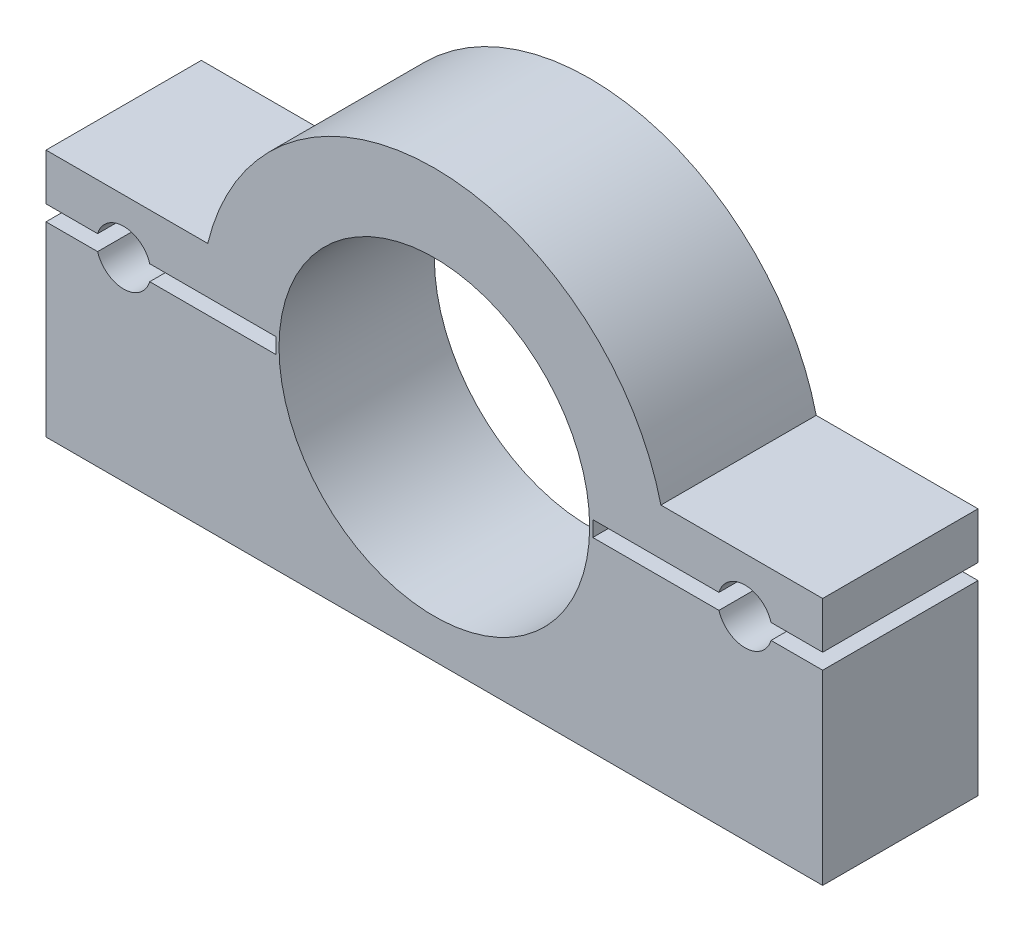
ISO-10303-21;
HEADER;
FILE_DESCRIPTION(('STEP AP214'),'2;1');
FILE_NAME('part.step','',(''),(''),'','','');
FILE_SCHEMA(('AUTOMOTIVE_DESIGN { 1 0 10303 214 1 1 1 1 }'));
ENDSEC;
DATA;
#1=APPLICATION_CONTEXT('core data for automotive mechanical design processes');
#2=APPLICATION_PROTOCOL_DEFINITION('international standard','automotive_design',2000,#1);
#3=PRODUCT_CONTEXT('',#1,'mechanical');
#4=PRODUCT('Part','Part','',(#3));
#5=PRODUCT_RELATED_PRODUCT_CATEGORY('part','',(#4));
#6=PRODUCT_DEFINITION_FORMATION('','',#4);
#7=PRODUCT_DEFINITION_CONTEXT('part definition',#1,'design');
#8=PRODUCT_DEFINITION('design','',#6,#7);
#9=PRODUCT_DEFINITION_SHAPE('','',#8);
#10=(LENGTH_UNIT() NAMED_UNIT(*) SI_UNIT(.MILLI.,.METRE.));
#11=(NAMED_UNIT(*) PLANE_ANGLE_UNIT() SI_UNIT($,.RADIAN.));
#12=(NAMED_UNIT(*) SI_UNIT($,.STERADIAN.) SOLID_ANGLE_UNIT());
#13=UNCERTAINTY_MEASURE_WITH_UNIT(LENGTH_MEASURE(1.E-05),#10,'distance_accuracy_value','');
#14=(GEOMETRIC_REPRESENTATION_CONTEXT(3) GLOBAL_UNCERTAINTY_ASSIGNED_CONTEXT((#13)) GLOBAL_UNIT_ASSIGNED_CONTEXT((#10,
#11,#12)) REPRESENTATION_CONTEXT('',''));
#15=CARTESIAN_POINT('',(0.,0.,0.));
#16=DIRECTION('',(0.,0.,1.));
#17=DIRECTION('',(1.,0.,0.));
#18=AXIS2_PLACEMENT_3D('',#15,#16,#17);
#19=CARTESIAN_POINT('',(51.,26.,-111.));
#20=DIRECTION('',(0.,1.,0.));
#21=DIRECTION('',(0.,0.,1.));
#22=AXIS2_PLACEMENT_3D('',#19,#20,#21);
#23=PLANE('',#22);
#24=DIRECTION('',(0.,0.,-1.));
#25=VECTOR('',#24,1.);
#26=CARTESIAN_POINT('',(43.3541019662497,26.,10.));
#27=LINE('',#26,#25);
#28=CARTESIAN_POINT('',(43.3541019662497,26.,-10.));
#29=VERTEX_POINT('',#28);
#30=CARTESIAN_POINT('',(43.3541019662497,26.,10.));
#31=VERTEX_POINT('',#30);
#32=EDGE_CURVE('E424',#29,#31,#27,.F.);
#33=ORIENTED_EDGE('',*,*,#32,.F.);
#34=DIRECTION('',(-1.,0.,0.));
#35=VECTOR('',#34,1.);
#36=CARTESIAN_POINT('',(0.,26.,-10.));
#37=LINE('',#36,#35);
#38=CARTESIAN_POINT('',(50.,26.,-10.));
#39=VERTEX_POINT('',#38);
#40=EDGE_CURVE('E391',#39,#29,#37,.T.);
#41=ORIENTED_EDGE('',*,*,#40,.F.);
#42=DIRECTION('',(0.,0.,-1.));
#43=VECTOR('',#42,1.);
#44=CARTESIAN_POINT('',(50.,26.,10.));
#45=LINE('',#44,#43);
#46=CARTESIAN_POINT('',(50.,26.,10.));
#47=VERTEX_POINT('',#46);
#48=EDGE_CURVE('E330',#47,#39,#45,.T.);
#49=ORIENTED_EDGE('',*,*,#48,.F.);
#50=DIRECTION('',(-1.,0.,0.));
#51=VECTOR('',#50,1.);
#52=CARTESIAN_POINT('',(0.,26.,10.));
#53=LINE('',#52,#51);
#54=EDGE_CURVE('E396',#47,#31,#53,.T.);
#55=ORIENTED_EDGE('',*,*,#54,.T.);
#56=EDGE_LOOP('',(#33,#41,#49,#55));
#57=FACE_BOUND('',#56,.T.);
#58=ADVANCED_FACE('F51',(#57),#23,.F.);
#59=DIRECTION('',(0.,0.,-1.));
#60=VECTOR('',#59,1.);
#61=CARTESIAN_POINT('',(36.6458980337503,26.,10.));
#62=LINE('',#61,#60);
#63=CARTESIAN_POINT('',(36.6458980337503,26.,10.));
#64=VERTEX_POINT('',#63);
#65=CARTESIAN_POINT('',(36.6458980337503,26.,-10.));
#66=VERTEX_POINT('',#65);
#67=EDGE_CURVE('E223',#64,#66,#62,.T.);
#68=ORIENTED_EDGE('',*,*,#67,.F.);
#69=CARTESIAN_POINT('',(20.4,26.,9.99999999999999));
#70=VERTEX_POINT('',#69);
#71=EDGE_CURVE('E395',#64,#70,#53,.T.);
#72=ORIENTED_EDGE('',*,*,#71,.T.);
#73=DIRECTION('',(0.,0.,1.));
#74=VECTOR('',#73,1.);
#75=CARTESIAN_POINT('',(20.4,26.,-111.));
#76=LINE('',#75,#74);
#77=CARTESIAN_POINT('',(20.4,26.,-9.99999999999999));
#78=VERTEX_POINT('',#77);
#79=EDGE_CURVE('E373',#78,#70,#76,.T.);
#80=ORIENTED_EDGE('',*,*,#79,.F.);
#81=EDGE_CURVE('E390',#66,#78,#37,.T.);
#82=ORIENTED_EDGE('',*,*,#81,.F.);
#83=EDGE_LOOP('',(#68,#72,#80,#82));
#84=FACE_BOUND('',#83,.T.);
#85=ADVANCED_FACE('F493',(#84),#23,.F.);
#86=CARTESIAN_POINT('',(20.4,24.,-111.));
#87=DIRECTION('',(0.,-1.,0.));
#88=DIRECTION('',(0.,0.,-1.));
#89=AXIS2_PLACEMENT_3D('',#86,#87,#88);
#90=PLANE('',#89);
#91=DIRECTION('',(0.,0.,-1.));
#92=VECTOR('',#91,1.);
#93=CARTESIAN_POINT('',(36.6458980337503,24.,10.));
#94=LINE('',#93,#92);
#95=CARTESIAN_POINT('',(36.6458980337503,24.,-10.));
#96=VERTEX_POINT('',#95);
#97=CARTESIAN_POINT('',(36.6458980337503,24.,10.));
#98=VERTEX_POINT('',#97);
#99=EDGE_CURVE('E11',#96,#98,#94,.F.);
#100=ORIENTED_EDGE('',*,*,#99,.F.);
#101=DIRECTION('',(1.,0.,0.));
#102=VECTOR('',#101,1.);
#103=CARTESIAN_POINT('',(0.,24.,-10.));
#104=LINE('',#103,#102);
#105=CARTESIAN_POINT('',(20.4,24.,-9.99999999999999));
#106=VERTEX_POINT('',#105);
#107=EDGE_CURVE('E367',#106,#96,#104,.T.);
#108=ORIENTED_EDGE('',*,*,#107,.F.);
#109=DIRECTION('',(0.,0.,1.));
#110=VECTOR('',#109,1.);
#111=CARTESIAN_POINT('',(20.4,24.,-111.));
#112=LINE('',#111,#110);
#113=CARTESIAN_POINT('',(20.4,24.,9.99999999999999));
#114=VERTEX_POINT('',#113);
#115=EDGE_CURVE('E380',#106,#114,#112,.T.);
#116=ORIENTED_EDGE('',*,*,#115,.T.);
#117=DIRECTION('',(1.,0.,0.));
#118=VECTOR('',#117,1.);
#119=CARTESIAN_POINT('',(0.,24.,10.));
#120=LINE('',#119,#118);
#121=EDGE_CURVE('E386',#114,#98,#120,.T.);
#122=ORIENTED_EDGE('',*,*,#121,.T.);
#123=EDGE_LOOP('',(#100,#108,#116,#122));
#124=FACE_BOUND('',#123,.T.);
#125=ADVANCED_FACE('F498',(#124),#90,.F.);
#126=DIRECTION('',(0.,0.,-1.));
#127=VECTOR('',#126,1.);
#128=CARTESIAN_POINT('',(43.3541019662497,24.,10.));
#129=LINE('',#128,#127);
#130=CARTESIAN_POINT('',(43.3541019662497,24.,10.));
#131=VERTEX_POINT('',#130);
#132=CARTESIAN_POINT('',(43.3541019662497,24.,-10.));
#133=VERTEX_POINT('',#132);
#134=EDGE_CURVE('E61',#131,#133,#129,.T.);
#135=ORIENTED_EDGE('',*,*,#134,.F.);
#136=CARTESIAN_POINT('',(50.,24.,10.));
#137=VERTEX_POINT('',#136);
#138=EDGE_CURVE('E377',#131,#137,#120,.T.);
#139=ORIENTED_EDGE('',*,*,#138,.T.);
#140=DIRECTION('',(0.,0.,1.));
#141=VECTOR('',#140,1.);
#142=CARTESIAN_POINT('',(50.,24.,10.));
#143=LINE('',#142,#141);
#144=CARTESIAN_POINT('',(50.,24.,-10.));
#145=VERTEX_POINT('',#144);
#146=EDGE_CURVE('E326',#145,#137,#143,.T.);
#147=ORIENTED_EDGE('',*,*,#146,.F.);
#148=EDGE_CURVE('E365',#133,#145,#104,.T.);
#149=ORIENTED_EDGE('',*,*,#148,.F.);
#150=EDGE_LOOP('',(#135,#139,#147,#149));
#151=FACE_BOUND('',#150,.T.);
#152=ADVANCED_FACE('F371',(#151),#90,.F.);
#153=CARTESIAN_POINT('',(-20.4,26.,-111.));
#154=DIRECTION('',(0.,1.,0.));
#155=DIRECTION('',(0.,0.,1.));
#156=AXIS2_PLACEMENT_3D('',#153,#154,#155);
#157=PLANE('',#156);
#158=DIRECTION('',(0.,0.,-1.));
#159=VECTOR('',#158,1.);
#160=CARTESIAN_POINT('',(-36.6458980337503,26.,10.));
#161=LINE('',#160,#159);
#162=CARTESIAN_POINT('',(-36.6458980337503,26.,-10.));
#163=VERTEX_POINT('',#162);
#164=CARTESIAN_POINT('',(-36.6458980337503,26.,10.));
#165=VERTEX_POINT('',#164);
#166=EDGE_CURVE('E203',#163,#165,#161,.F.);
#167=ORIENTED_EDGE('',*,*,#166,.F.);
#168=DIRECTION('',(-1.,0.,0.));
#169=VECTOR('',#168,1.);
#170=CARTESIAN_POINT('',(0.,26.,-10.));
#171=LINE('',#170,#169);
#172=CARTESIAN_POINT('',(-20.4,26.,-9.99999999999999));
#173=VERTEX_POINT('',#172);
#174=EDGE_CURVE('E218',#173,#163,#171,.T.);
#175=ORIENTED_EDGE('',*,*,#174,.F.);
#176=DIRECTION('',(0.,0.,1.));
#177=VECTOR('',#176,1.);
#178=CARTESIAN_POINT('',(-20.4,26.,-111.));
#179=LINE('',#178,#177);
#180=CARTESIAN_POINT('',(-20.4,26.,9.99999999999999));
#181=VERTEX_POINT('',#180);
#182=EDGE_CURVE('E384',#173,#181,#179,.T.);
#183=ORIENTED_EDGE('',*,*,#182,.T.);
#184=DIRECTION('',(-1.,0.,0.));
#185=VECTOR('',#184,1.);
#186=CARTESIAN_POINT('',(0.,26.,10.));
#187=LINE('',#186,#185);
#188=EDGE_CURVE('E221',#181,#165,#187,.T.);
#189=ORIENTED_EDGE('',*,*,#188,.T.);
#190=EDGE_LOOP('',(#167,#175,#183,#189));
#191=FACE_BOUND('',#190,.T.);
#192=ADVANCED_FACE('F216',(#191),#157,.F.);
#193=DIRECTION('',(0.,0.,-1.));
#194=VECTOR('',#193,1.);
#195=CARTESIAN_POINT('',(-43.3541019662497,26.,10.));
#196=LINE('',#195,#194);
#197=CARTESIAN_POINT('',(-43.3541019662497,26.,10.));
#198=VERTEX_POINT('',#197);
#199=CARTESIAN_POINT('',(-43.3541019662497,26.,-10.));
#200=VERTEX_POINT('',#199);
#201=EDGE_CURVE('E206',#198,#200,#196,.T.);
#202=ORIENTED_EDGE('',*,*,#201,.F.);
#203=CARTESIAN_POINT('',(-50.,26.,10.));
#204=VERTEX_POINT('',#203);
#205=EDGE_CURVE('E232',#198,#204,#187,.T.);
#206=ORIENTED_EDGE('',*,*,#205,.T.);
#207=DIRECTION('',(0.,0.,1.));
#208=VECTOR('',#207,1.);
#209=CARTESIAN_POINT('',(-50.,26.,10.));
#210=LINE('',#209,#208);
#211=CARTESIAN_POINT('',(-50.,26.,-10.));
#212=VERTEX_POINT('',#211);
#213=EDGE_CURVE('E338',#212,#204,#210,.T.);
#214=ORIENTED_EDGE('',*,*,#213,.F.);
#215=EDGE_CURVE('E233',#200,#212,#171,.T.);
#216=ORIENTED_EDGE('',*,*,#215,.F.);
#217=EDGE_LOOP('',(#202,#206,#214,#216));
#218=FACE_BOUND('',#217,.T.);
#219=ADVANCED_FACE('F451',(#218),#157,.F.);
#220=CARTESIAN_POINT('',(-51.,24.,-111.));
#221=DIRECTION('',(0.,-1.,0.));
#222=DIRECTION('',(0.,0.,-1.));
#223=AXIS2_PLACEMENT_3D('',#220,#221,#222);
#224=PLANE('',#223);
#225=DIRECTION('',(0.,0.,-1.));
#226=VECTOR('',#225,1.);
#227=CARTESIAN_POINT('',(-43.3541019662497,24.,10.));
#228=LINE('',#227,#226);
#229=CARTESIAN_POINT('',(-43.3541019662497,24.,-10.));
#230=VERTEX_POINT('',#229);
#231=CARTESIAN_POINT('',(-43.3541019662497,24.,10.));
#232=VERTEX_POINT('',#231);
#233=EDGE_CURVE('E351',#230,#232,#228,.F.);
#234=ORIENTED_EDGE('',*,*,#233,.F.);
#235=DIRECTION('',(1.,0.,0.));
#236=VECTOR('',#235,1.);
#237=CARTESIAN_POINT('',(0.,24.,-10.));
#238=LINE('',#237,#236);
#239=CARTESIAN_POINT('',(-50.,24.,-10.));
#240=VERTEX_POINT('',#239);
#241=EDGE_CURVE('E399',#240,#230,#238,.T.);
#242=ORIENTED_EDGE('',*,*,#241,.F.);
#243=DIRECTION('',(0.,0.,-1.));
#244=VECTOR('',#243,1.);
#245=CARTESIAN_POINT('',(-50.,24.,10.));
#246=LINE('',#245,#244);
#247=CARTESIAN_POINT('',(-50.,24.,10.));
#248=VERTEX_POINT('',#247);
#249=EDGE_CURVE('E334',#248,#240,#246,.T.);
#250=ORIENTED_EDGE('',*,*,#249,.F.);
#251=DIRECTION('',(1.,0.,0.));
#252=VECTOR('',#251,1.);
#253=CARTESIAN_POINT('',(0.,24.,10.));
#254=LINE('',#253,#252);
#255=EDGE_CURVE('E240',#248,#232,#254,.T.);
#256=ORIENTED_EDGE('',*,*,#255,.T.);
#257=EDGE_LOOP('',(#234,#242,#250,#256));
#258=FACE_BOUND('',#257,.T.);
#259=ADVANCED_FACE('F520',(#258),#224,.F.);
#260=DIRECTION('',(0.,0.,-1.));
#261=VECTOR('',#260,1.);
#262=CARTESIAN_POINT('',(-36.6458980337503,24.,10.));
#263=LINE('',#262,#261);
#264=CARTESIAN_POINT('',(-36.6458980337503,24.,10.));
#265=VERTEX_POINT('',#264);
#266=CARTESIAN_POINT('',(-36.6458980337503,24.,-10.));
#267=VERTEX_POINT('',#266);
#268=EDGE_CURVE('E348',#265,#267,#263,.T.);
#269=ORIENTED_EDGE('',*,*,#268,.F.);
#270=CARTESIAN_POINT('',(-20.4,24.,9.99999999999999));
#271=VERTEX_POINT('',#270);
#272=EDGE_CURVE('E402',#265,#271,#254,.T.);
#273=ORIENTED_EDGE('',*,*,#272,.T.);
#274=DIRECTION('',(0.,0.,1.));
#275=VECTOR('',#274,1.);
#276=CARTESIAN_POINT('',(-20.4,24.,-111.));
#277=LINE('',#276,#275);
#278=CARTESIAN_POINT('',(-20.4,24.,-9.99999999999999));
#279=VERTEX_POINT('',#278);
#280=EDGE_CURVE('E415',#279,#271,#277,.T.);
#281=ORIENTED_EDGE('',*,*,#280,.F.);
#282=EDGE_CURVE('E398',#267,#279,#238,.T.);
#283=ORIENTED_EDGE('',*,*,#282,.F.);
#284=EDGE_LOOP('',(#269,#273,#281,#283));
#285=FACE_BOUND('',#284,.T.);
#286=ADVANCED_FACE('F417',(#285),#224,.F.);
#287=CARTESIAN_POINT('',(-50.,32.,10.));
#288=DIRECTION('',(1.,0.,0.));
#289=DIRECTION('',(0.,0.,-1.));
#290=AXIS2_PLACEMENT_3D('',#287,#288,#289);
#291=PLANE('',#290);
#292=DIRECTION('',(0.,-1.,0.));
#293=VECTOR('',#292,1.);
#294=CARTESIAN_POINT('',(-50.,32.,-10.));
#295=LINE('',#294,#293);
#296=CARTESIAN_POINT('',(-50.,32.,-10.));
#297=VERTEX_POINT('',#296);
#298=EDGE_CURVE('E282',#297,#212,#295,.T.);
#299=ORIENTED_EDGE('',*,*,#298,.T.);
#300=ORIENTED_EDGE('',*,*,#213,.T.);
#301=DIRECTION('',(0.,-1.,0.));
#302=VECTOR('',#301,1.);
#303=CARTESIAN_POINT('',(-50.,32.,10.));
#304=LINE('',#303,#302);
#305=CARTESIAN_POINT('',(-50.,32.,10.));
#306=VERTEX_POINT('',#305);
#307=EDGE_CURVE('E259',#306,#204,#304,.T.);
#308=ORIENTED_EDGE('',*,*,#307,.F.);
#309=DIRECTION('',(0.,0.,-1.));
#310=VECTOR('',#309,1.);
#311=CARTESIAN_POINT('',(-50.,32.,10.));
#312=LINE('',#311,#310);
#313=EDGE_CURVE('E281',#306,#297,#312,.T.);
#314=ORIENTED_EDGE('',*,*,#313,.T.);
#315=EDGE_LOOP('',(#299,#300,#308,#314));
#316=FACE_BOUND('',#315,.T.);
#317=ADVANCED_FACE('F453',(#316),#291,.F.);
#318=CARTESIAN_POINT('',(50.,0.,10.));
#319=DIRECTION('',(-1.,0.,0.));
#320=DIRECTION('',(0.,0.,1.));
#321=AXIS2_PLACEMENT_3D('',#318,#319,#320);
#322=PLANE('',#321);
#323=DIRECTION('',(0.,1.,0.));
#324=VECTOR('',#323,1.);
#325=CARTESIAN_POINT('',(50.,0.,10.));
#326=LINE('',#325,#324);
#327=CARTESIAN_POINT('',(50.,32.,10.));
#328=VERTEX_POINT('',#327);
#329=EDGE_CURVE('E267',#47,#328,#326,.T.);
#330=ORIENTED_EDGE('',*,*,#329,.F.);
#331=ORIENTED_EDGE('',*,*,#48,.T.);
#332=DIRECTION('',(0.,1.,0.));
#333=VECTOR('',#332,1.);
#334=CARTESIAN_POINT('',(50.,0.,-10.));
#335=LINE('',#334,#333);
#336=CARTESIAN_POINT('',(50.,32.,-10.));
#337=VERTEX_POINT('',#336);
#338=EDGE_CURVE('E289',#39,#337,#335,.T.);
#339=ORIENTED_EDGE('',*,*,#338,.T.);
#340=DIRECTION('',(0.,0.,-1.));
#341=VECTOR('',#340,1.);
#342=CARTESIAN_POINT('',(50.,32.,10.));
#343=LINE('',#342,#341);
#344=EDGE_CURVE('E314',#328,#337,#343,.T.);
#345=ORIENTED_EDGE('',*,*,#344,.F.);
#346=EDGE_LOOP('',(#330,#331,#339,#345));
#347=FACE_BOUND('',#346,.T.);
#348=ADVANCED_FACE('F479',(#347),#322,.F.);
#349=CARTESIAN_POINT('',(0.,25.,10.));
#350=DIRECTION('',(0.,0.,1.));
#351=DIRECTION('',(1.,0.,0.));
#352=AXIS2_PLACEMENT_3D('',#349,#350,#351);
#353=PLANE('',#352);
#354=ORIENTED_EDGE('',*,*,#272,.F.);
#355=CARTESIAN_POINT('',(-40.,25.,10.));
#356=DIRECTION('',(0.,0.,1.));
#357=DIRECTION('',(1.,0.,0.));
#358=AXIS2_PLACEMENT_3D('',#355,#356,#357);
#359=CIRCLE('',#358,3.5);
#360=EDGE_CURVE('E211',#232,#265,#359,.T.);
#361=ORIENTED_EDGE('',*,*,#360,.F.);
#362=ORIENTED_EDGE('',*,*,#255,.F.);
#363=CARTESIAN_POINT('',(-50.,0.,10.));
#364=VERTEX_POINT('',#363);
#365=EDGE_CURVE('E264',#248,#364,#304,.T.);
#366=ORIENTED_EDGE('',*,*,#365,.T.);
#367=DIRECTION('',(1.,0.,0.));
#368=VECTOR('',#367,1.);
#369=CARTESIAN_POINT('',(-50.,0.,10.));
#370=LINE('',#369,#368);
#371=CARTESIAN_POINT('',(50.,0.,10.));
#372=VERTEX_POINT('',#371);
#373=EDGE_CURVE('E263',#364,#372,#370,.T.);
#374=ORIENTED_EDGE('',*,*,#373,.T.);
#375=EDGE_CURVE('E268',#372,#137,#326,.T.);
#376=ORIENTED_EDGE('',*,*,#375,.T.);
#377=ORIENTED_EDGE('',*,*,#138,.F.);
#378=CARTESIAN_POINT('',(40.,25.,10.));
#379=DIRECTION('',(0.,0.,1.));
#380=DIRECTION('',(1.,0.,0.));
#381=AXIS2_PLACEMENT_3D('',#378,#379,#380);
#382=CIRCLE('',#381,3.5);
#383=EDGE_CURVE('E75',#98,#131,#382,.T.);
#384=ORIENTED_EDGE('',*,*,#383,.F.);
#385=ORIENTED_EDGE('',*,*,#121,.F.);
#386=DIRECTION('',(0.,-1.,0.));
#387=VECTOR('',#386,1.);
#388=CARTESIAN_POINT('',(20.4,25.,10.));
#389=LINE('',#388,#387);
#390=EDGE_CURVE('E248',#70,#114,#389,.T.);
#391=ORIENTED_EDGE('',*,*,#390,.F.);
#392=ORIENTED_EDGE('',*,*,#71,.F.);
#393=EDGE_CURVE('E68',#31,#64,#382,.T.);
#394=ORIENTED_EDGE('',*,*,#393,.F.);
#395=ORIENTED_EDGE('',*,*,#54,.F.);
#396=ORIENTED_EDGE('',*,*,#329,.T.);
#397=DIRECTION('',(-1.,0.,0.));
#398=VECTOR('',#397,1.);
#399=CARTESIAN_POINT('',(50.,32.,10.));
#400=LINE('',#399,#398);
#401=CARTESIAN_POINT('',(29.1719,32.,10.));
#402=VERTEX_POINT('',#401);
#403=EDGE_CURVE('E272',#328,#402,#400,.T.);
#404=ORIENTED_EDGE('',*,*,#403,.T.);
#405=CARTESIAN_POINT('',(0.,25.,10.));
#406=DIRECTION('',(0.,0.,1.));
#407=DIRECTION('',(1.,0.,0.));
#408=AXIS2_PLACEMENT_3D('',#405,#406,#407);
#409=CIRCLE('',#408,29.999995826833);
#410=CARTESIAN_POINT('',(-29.1719,32.,10.));
#411=VERTEX_POINT('',#410);
#412=EDGE_CURVE('E275',#402,#411,#409,.T.);
#413=ORIENTED_EDGE('',*,*,#412,.T.);
#414=DIRECTION('',(-1.,0.,0.));
#415=VECTOR('',#414,1.);
#416=CARTESIAN_POINT('',(-29.1719,32.,10.));
#417=LINE('',#416,#415);
#418=EDGE_CURVE('E278',#411,#306,#417,.T.);
#419=ORIENTED_EDGE('',*,*,#418,.T.);
#420=ORIENTED_EDGE('',*,*,#307,.T.);
#421=ORIENTED_EDGE('',*,*,#205,.F.);
#422=EDGE_CURVE('E431',#165,#198,#359,.T.);
#423=ORIENTED_EDGE('',*,*,#422,.F.);
#424=ORIENTED_EDGE('',*,*,#188,.F.);
#425=DIRECTION('',(0.,1.,0.));
#426=VECTOR('',#425,1.);
#427=CARTESIAN_POINT('',(-20.4,25.,10.));
#428=LINE('',#427,#426);
#429=EDGE_CURVE('E245',#271,#181,#428,.T.);
#430=ORIENTED_EDGE('',*,*,#429,.F.);
#431=EDGE_LOOP('',(#354,#361,#362,#366,#374,#376,#377,#384,#385,#391,#392,#394,#395,#396,#404,
#413,#419,#420,#421,#423,#424,#430));
#432=FACE_BOUND('',#431,.T.);
#433=CARTESIAN_POINT('',(0.,25.,10.));
#434=DIRECTION('',(0.,0.,1.));
#435=DIRECTION('',(1.,0.,0.));
#436=AXIS2_PLACEMENT_3D('',#433,#434,#435);
#437=CIRCLE('',#436,20.);
#438=CARTESIAN_POINT('',(20.,25.,10.));
#439=VERTEX_POINT('',#438);
#440=EDGE_CURVE('E251',#439,#439,#437,.T.);
#441=ORIENTED_EDGE('',*,*,#440,.F.);
#442=EDGE_LOOP('',(#441));
#443=FACE_BOUND('',#442,.T.);
#444=ADVANCED_FACE('F445',(#432,#443),#353,.T.);
#445=CARTESIAN_POINT('',(0.,25.,-10.));
#446=DIRECTION('',(0.,0.,1.));
#447=DIRECTION('',(1.,0.,0.));
#448=AXIS2_PLACEMENT_3D('',#445,#446,#447);
#449=PLANE('',#448);
#450=CARTESIAN_POINT('',(-40.,25.,-10.));
#451=DIRECTION('',(0.,0.,1.));
#452=DIRECTION('',(1.,0.,0.));
#453=AXIS2_PLACEMENT_3D('',#450,#451,#452);
#454=CIRCLE('',#453,3.5);
#455=EDGE_CURVE('E212',#230,#267,#454,.T.);
#456=ORIENTED_EDGE('',*,*,#455,.T.);
#457=ORIENTED_EDGE('',*,*,#282,.T.);
#458=DIRECTION('',(0.,1.,0.));
#459=VECTOR('',#458,1.);
#460=CARTESIAN_POINT('',(-20.4,25.,-10.));
#461=LINE('',#460,#459);
#462=EDGE_CURVE('E230',#279,#173,#461,.T.);
#463=ORIENTED_EDGE('',*,*,#462,.T.);
#464=ORIENTED_EDGE('',*,*,#174,.T.);
#465=EDGE_CURVE('E200',#163,#200,#454,.T.);
#466=ORIENTED_EDGE('',*,*,#465,.T.);
#467=ORIENTED_EDGE('',*,*,#215,.T.);
#468=ORIENTED_EDGE('',*,*,#298,.F.);
#469=DIRECTION('',(-1.,0.,0.));
#470=VECTOR('',#469,1.);
#471=CARTESIAN_POINT('',(-29.1719,32.,-10.));
#472=LINE('',#471,#470);
#473=CARTESIAN_POINT('',(-29.1719,32.,-10.));
#474=VERTEX_POINT('',#473);
#475=EDGE_CURVE('E300',#474,#297,#472,.T.);
#476=ORIENTED_EDGE('',*,*,#475,.F.);
#477=CARTESIAN_POINT('',(0.,25.,-10.));
#478=DIRECTION('',(0.,0.,1.));
#479=DIRECTION('',(1.,0.,0.));
#480=AXIS2_PLACEMENT_3D('',#477,#478,#479);
#481=CIRCLE('',#480,29.999995826833);
#482=CARTESIAN_POINT('',(29.1719,32.,-10.));
#483=VERTEX_POINT('',#482);
#484=EDGE_CURVE('E297',#483,#474,#481,.T.);
#485=ORIENTED_EDGE('',*,*,#484,.F.);
#486=DIRECTION('',(-1.,0.,0.));
#487=VECTOR('',#486,1.);
#488=CARTESIAN_POINT('',(50.,32.,-10.));
#489=LINE('',#488,#487);
#490=EDGE_CURVE('E294',#337,#483,#489,.T.);
#491=ORIENTED_EDGE('',*,*,#490,.F.);
#492=ORIENTED_EDGE('',*,*,#338,.F.);
#493=ORIENTED_EDGE('',*,*,#40,.T.);
#494=CARTESIAN_POINT('',(40.,25.,-10.));
#495=DIRECTION('',(0.,0.,1.));
#496=DIRECTION('',(1.,0.,0.));
#497=AXIS2_PLACEMENT_3D('',#494,#495,#496);
#498=CIRCLE('',#497,3.5);
#499=EDGE_CURVE('E369',#29,#66,#498,.T.);
#500=ORIENTED_EDGE('',*,*,#499,.T.);
#501=ORIENTED_EDGE('',*,*,#81,.T.);
#502=DIRECTION('',(0.,-1.,0.));
#503=VECTOR('',#502,1.);
#504=CARTESIAN_POINT('',(20.4,25.,-10.));
#505=LINE('',#504,#503);
#506=EDGE_CURVE('E344',#78,#106,#505,.T.);
#507=ORIENTED_EDGE('',*,*,#506,.T.);
#508=ORIENTED_EDGE('',*,*,#107,.T.);
#509=EDGE_CURVE('E358',#96,#133,#498,.T.);
#510=ORIENTED_EDGE('',*,*,#509,.T.);
#511=ORIENTED_EDGE('',*,*,#148,.T.);
#512=CARTESIAN_POINT('',(50.,0.,-10.));
#513=VERTEX_POINT('',#512);
#514=EDGE_CURVE('E290',#513,#145,#335,.T.);
#515=ORIENTED_EDGE('',*,*,#514,.F.);
#516=DIRECTION('',(1.,0.,0.));
#517=VECTOR('',#516,1.);
#518=CARTESIAN_POINT('',(-50.,0.,-10.));
#519=LINE('',#518,#517);
#520=CARTESIAN_POINT('',(-50.,0.,-10.));
#521=VERTEX_POINT('',#520);
#522=EDGE_CURVE('E286',#521,#513,#519,.T.);
#523=ORIENTED_EDGE('',*,*,#522,.F.);
#524=EDGE_CURVE('E255',#240,#521,#295,.T.);
#525=ORIENTED_EDGE('',*,*,#524,.F.);
#526=ORIENTED_EDGE('',*,*,#241,.T.);
#527=EDGE_LOOP('',(#456,#457,#463,#464,#466,#467,#468,#476,#485,#491,#492,#493,#500,#501,#507,
#508,#510,#511,#515,#523,#525,#526));
#528=FACE_BOUND('',#527,.T.);
#529=CARTESIAN_POINT('',(0.,25.,-10.));
#530=DIRECTION('',(0.,0.,1.));
#531=DIRECTION('',(1.,0.,0.));
#532=AXIS2_PLACEMENT_3D('',#529,#530,#531);
#533=CIRCLE('',#532,20.);
#534=CARTESIAN_POINT('',(20.,25.,-10.));
#535=VERTEX_POINT('',#534);
#536=EDGE_CURVE('E250',#535,#535,#533,.T.);
#537=ORIENTED_EDGE('',*,*,#536,.T.);
#538=EDGE_LOOP('',(#537));
#539=FACE_BOUND('',#538,.T.);
#540=ADVANCED_FACE('F227',(#528,#539),#449,.F.);
#541=ORIENTED_EDGE('',*,*,#365,.F.);
#542=ORIENTED_EDGE('',*,*,#249,.T.);
#543=ORIENTED_EDGE('',*,*,#524,.T.);
#544=DIRECTION('',(0.,0.,-1.));
#545=VECTOR('',#544,1.);
#546=CARTESIAN_POINT('',(-50.,0.,10.));
#547=LINE('',#546,#545);
#548=EDGE_CURVE('E322',#364,#521,#547,.T.);
#549=ORIENTED_EDGE('',*,*,#548,.F.);
#550=EDGE_LOOP('',(#541,#542,#543,#549));
#551=FACE_BOUND('',#550,.T.);
#552=ADVANCED_FACE('F54',(#551),#291,.F.);
#553=CARTESIAN_POINT('',(-50.,0.,10.));
#554=DIRECTION('',(0.,1.,0.));
#555=DIRECTION('',(0.,0.,1.));
#556=AXIS2_PLACEMENT_3D('',#553,#554,#555);
#557=PLANE('',#556);
#558=ORIENTED_EDGE('',*,*,#522,.T.);
#559=DIRECTION('',(0.,0.,-1.));
#560=VECTOR('',#559,1.);
#561=CARTESIAN_POINT('',(50.,0.,10.));
#562=LINE('',#561,#560);
#563=EDGE_CURVE('E318',#372,#513,#562,.T.);
#564=ORIENTED_EDGE('',*,*,#563,.F.);
#565=ORIENTED_EDGE('',*,*,#373,.F.);
#566=ORIENTED_EDGE('',*,*,#548,.T.);
#567=EDGE_LOOP('',(#558,#564,#565,#566));
#568=FACE_BOUND('',#567,.T.);
#569=ADVANCED_FACE('F490',(#568),#557,.F.);
#570=ORIENTED_EDGE('',*,*,#514,.T.);
#571=ORIENTED_EDGE('',*,*,#146,.T.);
#572=ORIENTED_EDGE('',*,*,#375,.F.);
#573=ORIENTED_EDGE('',*,*,#563,.T.);
#574=EDGE_LOOP('',(#570,#571,#572,#573));
#575=FACE_BOUND('',#574,.T.);
#576=ADVANCED_FACE('F482',(#575),#322,.F.);
#577=CARTESIAN_POINT('',(50.,32.,10.));
#578=DIRECTION('',(0.,-1.,0.));
#579=DIRECTION('',(0.,0.,-1.));
#580=AXIS2_PLACEMENT_3D('',#577,#578,#579);
#581=PLANE('',#580);
#582=ORIENTED_EDGE('',*,*,#490,.T.);
#583=DIRECTION('',(0.,0.,-1.));
#584=VECTOR('',#583,1.);
#585=CARTESIAN_POINT('',(29.1719,32.,10.));
#586=LINE('',#585,#584);
#587=EDGE_CURVE('E310',#402,#483,#586,.T.);
#588=ORIENTED_EDGE('',*,*,#587,.F.);
#589=ORIENTED_EDGE('',*,*,#403,.F.);
#590=ORIENTED_EDGE('',*,*,#344,.T.);
#591=EDGE_LOOP('',(#582,#588,#589,#590));
#592=FACE_BOUND('',#591,.T.);
#593=ADVANCED_FACE('F469',(#592),#581,.F.);
#594=CARTESIAN_POINT('',(0.,25.,10.));
#595=DIRECTION('',(0.,0.,-1.));
#596=DIRECTION('',(-1.,0.,0.));
#597=AXIS2_PLACEMENT_3D('',#594,#595,#596);
#598=CYLINDRICAL_SURFACE('',#597,29.999995826833);
#599=ORIENTED_EDGE('',*,*,#484,.T.);
#600=DIRECTION('',(0.,0.,-1.));
#601=VECTOR('',#600,1.);
#602=CARTESIAN_POINT('',(-29.1719,32.,10.));
#603=LINE('',#602,#601);
#604=EDGE_CURVE('E306',#411,#474,#603,.T.);
#605=ORIENTED_EDGE('',*,*,#604,.F.);
#606=ORIENTED_EDGE('',*,*,#412,.F.);
#607=ORIENTED_EDGE('',*,*,#587,.T.);
#608=EDGE_LOOP('',(#599,#605,#606,#607));
#609=FACE_BOUND('',#608,.T.);
#610=ADVANCED_FACE('F465',(#609),#598,.T.);
#611=CARTESIAN_POINT('',(-29.1719,32.,10.));
#612=DIRECTION('',(0.,-1.,0.));
#613=DIRECTION('',(0.,0.,-1.));
#614=AXIS2_PLACEMENT_3D('',#611,#612,#613);
#615=PLANE('',#614);
#616=ORIENTED_EDGE('',*,*,#475,.T.);
#617=ORIENTED_EDGE('',*,*,#313,.F.);
#618=ORIENTED_EDGE('',*,*,#418,.F.);
#619=ORIENTED_EDGE('',*,*,#604,.T.);
#620=EDGE_LOOP('',(#616,#617,#618,#619));
#621=FACE_BOUND('',#620,.T.);
#622=ADVANCED_FACE('F460',(#621),#615,.F.);
#623=CARTESIAN_POINT('',(0.,25.,10.));
#624=DIRECTION('',(0.,0.,-1.));
#625=DIRECTION('',(-1.,0.,0.));
#626=AXIS2_PLACEMENT_3D('',#623,#624,#625);
#627=CYLINDRICAL_SURFACE('',#626,20.);
#628=ORIENTED_EDGE('',*,*,#440,.T.);
#629=EDGE_LOOP('',(#628));
#630=FACE_BOUND('',#629,.T.);
#631=ORIENTED_EDGE('',*,*,#536,.F.);
#632=EDGE_LOOP('',(#631));
#633=FACE_BOUND('',#632,.T.);
#634=ADVANCED_FACE('F517',(#630,#633),#627,.F.);
#635=CARTESIAN_POINT('',(20.4,26.,-111.));
#636=DIRECTION('',(-1.,0.,0.));
#637=DIRECTION('',(0.,0.,1.));
#638=AXIS2_PLACEMENT_3D('',#635,#636,#637);
#639=PLANE('',#638);
#640=ORIENTED_EDGE('',*,*,#390,.T.);
#641=ORIENTED_EDGE('',*,*,#115,.F.);
#642=ORIENTED_EDGE('',*,*,#506,.F.);
#643=ORIENTED_EDGE('',*,*,#79,.T.);
#644=EDGE_LOOP('',(#640,#641,#642,#643));
#645=FACE_BOUND('',#644,.T.);
#646=ADVANCED_FACE('F513',(#645),#639,.F.);
#647=CARTESIAN_POINT('',(-20.4,24.,-111.));
#648=DIRECTION('',(1.,0.,0.));
#649=DIRECTION('',(0.,0.,-1.));
#650=AXIS2_PLACEMENT_3D('',#647,#648,#649);
#651=PLANE('',#650);
#652=ORIENTED_EDGE('',*,*,#429,.T.);
#653=ORIENTED_EDGE('',*,*,#182,.F.);
#654=ORIENTED_EDGE('',*,*,#462,.F.);
#655=ORIENTED_EDGE('',*,*,#280,.T.);
#656=EDGE_LOOP('',(#652,#653,#654,#655));
#657=FACE_BOUND('',#656,.T.);
#658=ADVANCED_FACE('F414',(#657),#651,.F.);
#659=CARTESIAN_POINT('',(-40.,25.,10.));
#660=DIRECTION('',(0.,0.,-1.));
#661=DIRECTION('',(-1.,0.,0.));
#662=AXIS2_PLACEMENT_3D('',#659,#660,#661);
#663=CYLINDRICAL_SURFACE('',#662,3.5);
#664=ORIENTED_EDGE('',*,*,#233,.T.);
#665=ORIENTED_EDGE('',*,*,#360,.T.);
#666=ORIENTED_EDGE('',*,*,#268,.T.);
#667=ORIENTED_EDGE('',*,*,#455,.F.);
#668=EDGE_LOOP('',(#664,#665,#666,#667));
#669=FACE_BOUND('',#668,.T.);
#670=ADVANCED_FACE('F440',(#669),#663,.F.);
#671=ORIENTED_EDGE('',*,*,#166,.T.);
#672=ORIENTED_EDGE('',*,*,#422,.T.);
#673=ORIENTED_EDGE('',*,*,#201,.T.);
#674=ORIENTED_EDGE('',*,*,#465,.F.);
#675=EDGE_LOOP('',(#671,#672,#673,#674));
#676=FACE_BOUND('',#675,.T.);
#677=ADVANCED_FACE('F202',(#676),#663,.F.);
#678=CARTESIAN_POINT('',(40.,25.,10.));
#679=DIRECTION('',(0.,0.,-1.));
#680=DIRECTION('',(-1.,0.,0.));
#681=AXIS2_PLACEMENT_3D('',#678,#679,#680);
#682=CYLINDRICAL_SURFACE('',#681,3.5);
#683=ORIENTED_EDGE('',*,*,#99,.T.);
#684=ORIENTED_EDGE('',*,*,#383,.T.);
#685=ORIENTED_EDGE('',*,*,#134,.T.);
#686=ORIENTED_EDGE('',*,*,#509,.F.);
#687=EDGE_LOOP('',(#683,#684,#685,#686));
#688=FACE_BOUND('',#687,.T.);
#689=ADVANCED_FACE('F357',(#688),#682,.F.);
#690=ORIENTED_EDGE('',*,*,#32,.T.);
#691=ORIENTED_EDGE('',*,*,#393,.T.);
#692=ORIENTED_EDGE('',*,*,#67,.T.);
#693=ORIENTED_EDGE('',*,*,#499,.F.);
#694=EDGE_LOOP('',(#690,#691,#692,#693));
#695=FACE_BOUND('',#694,.T.);
#696=ADVANCED_FACE('F506',(#695),#682,.F.);
#697=CLOSED_SHELL('',(#58,#85,#125,#152,#192,#219,#259,#286,#317,#348,#444,#540,#552,#569,#576,
#593,#610,#622,#634,#646,#658,#670,#677,#689,#696));
#698=MANIFOLD_SOLID_BREP('B2',#697);
#699=ADVANCED_BREP_SHAPE_REPRESENTATION('',(#18,#698),#14);
#700=SHAPE_DEFINITION_REPRESENTATION(#9,#699);
ENDSEC;
END-ISO-10303-21;
